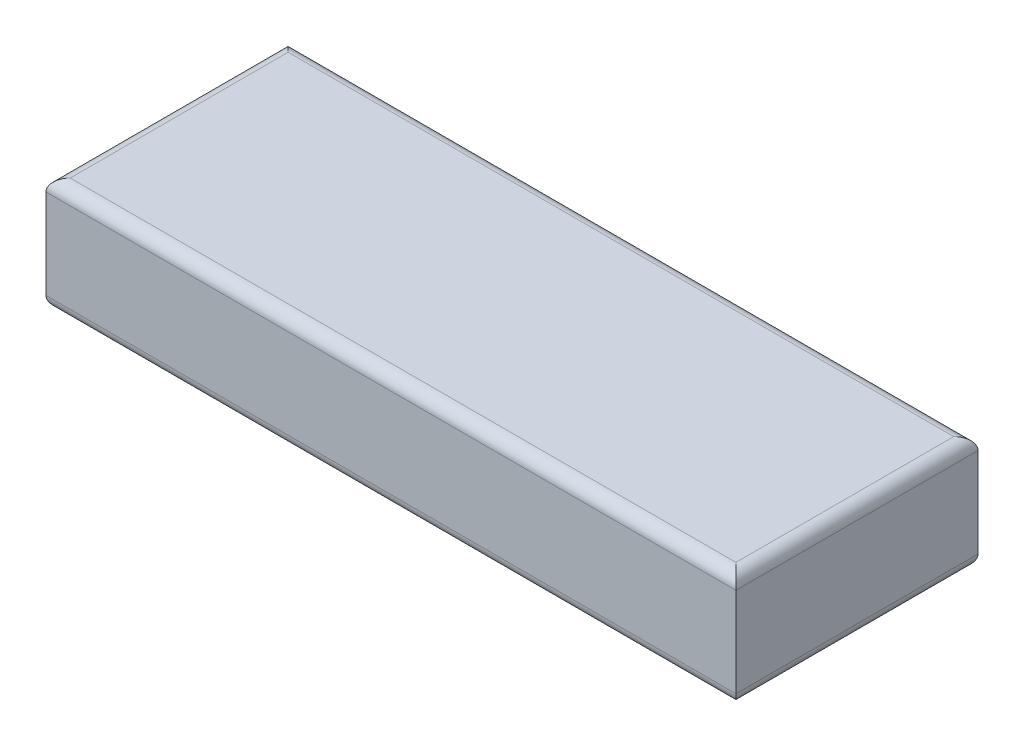
ISO-10303-21;
HEADER;
FILE_DESCRIPTION(('STEP AP214'),'2;1');
FILE_NAME('part.step','',(''),(''),'','','');
FILE_SCHEMA(('AUTOMOTIVE_DESIGN { 1 0 10303 214 1 1 1 1 }'));
ENDSEC;
DATA;
#1=APPLICATION_CONTEXT('core data for automotive mechanical design processes');
#2=APPLICATION_PROTOCOL_DEFINITION('international standard','automotive_design',2000,#1);
#3=PRODUCT_CONTEXT('',#1,'mechanical');
#4=PRODUCT('Part','Part','',(#3));
#5=PRODUCT_RELATED_PRODUCT_CATEGORY('part','',(#4));
#6=PRODUCT_DEFINITION_FORMATION('','',#4);
#7=PRODUCT_DEFINITION_CONTEXT('part definition',#1,'design');
#8=PRODUCT_DEFINITION('design','',#6,#7);
#9=PRODUCT_DEFINITION_SHAPE('','',#8);
#10=(LENGTH_UNIT() NAMED_UNIT(*) SI_UNIT(.MILLI.,.METRE.));
#11=(NAMED_UNIT(*) PLANE_ANGLE_UNIT() SI_UNIT($,.RADIAN.));
#12=(NAMED_UNIT(*) SI_UNIT($,.STERADIAN.) SOLID_ANGLE_UNIT());
#13=UNCERTAINTY_MEASURE_WITH_UNIT(LENGTH_MEASURE(1.E-05),#10,'distance_accuracy_value','');
#14=(GEOMETRIC_REPRESENTATION_CONTEXT(3) GLOBAL_UNCERTAINTY_ASSIGNED_CONTEXT((#13)) GLOBAL_UNIT_ASSIGNED_CONTEXT((#10,
#11,#12)) REPRESENTATION_CONTEXT('',''));
#15=CARTESIAN_POINT('',(0.,0.,0.));
#16=DIRECTION('',(0.,0.,1.));
#17=DIRECTION('',(1.,0.,0.));
#18=AXIS2_PLACEMENT_3D('',#15,#16,#17);
#19=CARTESIAN_POINT('',(14.478,4.77528789662104,-5.08));
#20=DIRECTION('',(-1.,0.,0.));
#21=DIRECTION('',(0.,0.,1.));
#22=AXIS2_PLACEMENT_3D('',#19,#20,#21);
#23=PLANE('',#22);
#24=DIRECTION('',(0.,-1.,0.));
#25=VECTOR('',#24,1.);
#26=CARTESIAN_POINT('',(14.478,4.77528789662104,-5.08));
#27=LINE('',#26,#25);
#28=CARTESIAN_POINT('',(14.478,4.26728789662104,-5.08));
#29=VERTEX_POINT('',#28);
#30=CARTESIAN_POINT('',(14.478,0.508000000000002,-5.08));
#31=VERTEX_POINT('',#30);
#32=EDGE_CURVE('E120',#29,#31,#27,.T.);
#33=ORIENTED_EDGE('',*,*,#32,.F.);
#34=DIRECTION('',(0.,0.,-1.));
#35=VECTOR('',#34,1.);
#36=CARTESIAN_POINT('',(14.478,4.26728789662104,5.08));
#37=LINE('',#36,#35);
#38=CARTESIAN_POINT('',(14.478,4.26728789662104,5.08));
#39=VERTEX_POINT('',#38);
#40=EDGE_CURVE('E144',#29,#39,#37,.F.);
#41=ORIENTED_EDGE('',*,*,#40,.T.);
#42=DIRECTION('',(0.,-1.,0.));
#43=VECTOR('',#42,1.);
#44=CARTESIAN_POINT('',(14.478,4.77528789662104,5.08));
#45=LINE('',#44,#43);
#46=CARTESIAN_POINT('',(14.478,0.508000000000002,5.08));
#47=VERTEX_POINT('',#46);
#48=EDGE_CURVE('E155',#39,#47,#45,.T.);
#49=ORIENTED_EDGE('',*,*,#48,.T.);
#50=DIRECTION('',(0.,0.,-1.));
#51=VECTOR('',#50,1.);
#52=CARTESIAN_POINT('',(14.478,0.508,-5.08));
#53=LINE('',#52,#51);
#54=EDGE_CURVE('E142',#47,#31,#53,.T.);
#55=ORIENTED_EDGE('',*,*,#54,.T.);
#56=EDGE_LOOP('',(#33,#41,#49,#55));
#57=FACE_BOUND('',#56,.T.);
#58=ADVANCED_FACE('F35',(#57),#23,.F.);
#59=CARTESIAN_POINT('',(-14.478,4.77528789662104,-5.08));
#60=DIRECTION('',(0.,0.,1.));
#61=DIRECTION('',(1.,0.,0.));
#62=AXIS2_PLACEMENT_3D('',#59,#60,#61);
#63=PLANE('',#62);
#64=DIRECTION('',(0.,-1.,0.));
#65=VECTOR('',#64,1.);
#66=CARTESIAN_POINT('',(-14.478,4.77528789662104,-5.08));
#67=LINE('',#66,#65);
#68=CARTESIAN_POINT('',(-14.478,4.26728789662104,-5.08));
#69=VERTEX_POINT('',#68);
#70=CARTESIAN_POINT('',(-14.478,0.508000000000002,-5.08));
#71=VERTEX_POINT('',#70);
#72=EDGE_CURVE('E322',#69,#71,#67,.T.);
#73=ORIENTED_EDGE('',*,*,#72,.F.);
#74=DIRECTION('',(-1.,0.,0.));
#75=VECTOR('',#74,1.);
#76=CARTESIAN_POINT('',(14.478,4.26728789662104,-5.08));
#77=LINE('',#76,#75);
#78=EDGE_CURVE('E140',#69,#29,#77,.F.);
#79=ORIENTED_EDGE('',*,*,#78,.T.);
#80=ORIENTED_EDGE('',*,*,#32,.T.);
#81=DIRECTION('',(-1.,0.,0.));
#82=VECTOR('',#81,1.);
#83=CARTESIAN_POINT('',(-14.478,0.508,-5.08));
#84=LINE('',#83,#82);
#85=EDGE_CURVE('E137',#31,#71,#84,.T.);
#86=ORIENTED_EDGE('',*,*,#85,.T.);
#87=EDGE_LOOP('',(#73,#79,#80,#86));
#88=FACE_BOUND('',#87,.T.);
#89=ADVANCED_FACE('F192',(#88),#63,.F.);
#90=CARTESIAN_POINT('',(-14.478,4.77528789662104,-5.08));
#91=DIRECTION('',(1.,0.,0.));
#92=DIRECTION('',(0.,0.,-1.));
#93=AXIS2_PLACEMENT_3D('',#90,#91,#92);
#94=PLANE('',#93);
#95=DIRECTION('',(0.,-1.,0.));
#96=VECTOR('',#95,1.);
#97=CARTESIAN_POINT('',(-14.478,4.77528789662104,5.08));
#98=LINE('',#97,#96);
#99=CARTESIAN_POINT('',(-14.478,4.26728789662104,5.08));
#100=VERTEX_POINT('',#99);
#101=CARTESIAN_POINT('',(-14.478,0.508000000000002,5.08));
#102=VERTEX_POINT('',#101);
#103=EDGE_CURVE('E318',#100,#102,#98,.T.);
#104=ORIENTED_EDGE('',*,*,#103,.F.);
#105=DIRECTION('',(0.,0.,1.));
#106=VECTOR('',#105,1.);
#107=CARTESIAN_POINT('',(-14.478,4.26728789662104,-5.08));
#108=LINE('',#107,#106);
#109=EDGE_CURVE('E135',#100,#69,#108,.F.);
#110=ORIENTED_EDGE('',*,*,#109,.T.);
#111=ORIENTED_EDGE('',*,*,#72,.T.);
#112=DIRECTION('',(0.,0.,1.));
#113=VECTOR('',#112,1.);
#114=CARTESIAN_POINT('',(-14.478,0.508,-5.08));
#115=LINE('',#114,#113);
#116=EDGE_CURVE('E133',#71,#102,#115,.T.);
#117=ORIENTED_EDGE('',*,*,#116,.T.);
#118=EDGE_LOOP('',(#104,#110,#111,#117));
#119=FACE_BOUND('',#118,.T.);
#120=ADVANCED_FACE('F198',(#119),#94,.F.);
#121=CARTESIAN_POINT('',(-14.478,4.77528789662104,5.08));
#122=DIRECTION('',(0.,0.,-1.));
#123=DIRECTION('',(-1.,0.,0.));
#124=AXIS2_PLACEMENT_3D('',#121,#122,#123);
#125=PLANE('',#124);
#126=ORIENTED_EDGE('',*,*,#48,.F.);
#127=DIRECTION('',(1.,0.,0.));
#128=VECTOR('',#127,1.);
#129=CARTESIAN_POINT('',(-14.478,4.26728789662104,5.08));
#130=LINE('',#129,#128);
#131=EDGE_CURVE('E107',#39,#100,#130,.F.);
#132=ORIENTED_EDGE('',*,*,#131,.T.);
#133=ORIENTED_EDGE('',*,*,#103,.T.);
#134=DIRECTION('',(1.,0.,0.));
#135=VECTOR('',#134,1.);
#136=CARTESIAN_POINT('',(-14.478,0.508,5.08));
#137=LINE('',#136,#135);
#138=EDGE_CURVE('E126',#102,#47,#137,.T.);
#139=ORIENTED_EDGE('',*,*,#138,.T.);
#140=EDGE_LOOP('',(#126,#132,#133,#139));
#141=FACE_BOUND('',#140,.T.);
#142=ADVANCED_FACE('F188',(#141),#125,.F.);
#143=CARTESIAN_POINT('',(0.,4.77528789662104,0.));
#144=DIRECTION('',(0.,1.,0.));
#145=DIRECTION('',(0.,0.,1.));
#146=AXIS2_PLACEMENT_3D('',#143,#144,#145);
#147=PLANE('',#146);
#148=DIRECTION('',(0.,0.,1.));
#149=VECTOR('',#148,1.);
#150=CARTESIAN_POINT('',(-13.97,4.77528789662104,5.08));
#151=LINE('',#150,#149);
#152=CARTESIAN_POINT('',(-13.97,4.77528789662104,-4.572));
#153=VERTEX_POINT('',#152);
#154=CARTESIAN_POINT('',(-13.97,4.77528789662104,4.572));
#155=VERTEX_POINT('',#154);
#156=EDGE_CURVE('E124',#153,#155,#151,.T.);
#157=ORIENTED_EDGE('',*,*,#156,.T.);
#158=DIRECTION('',(1.,0.,0.));
#159=VECTOR('',#158,1.);
#160=CARTESIAN_POINT('',(14.478,4.77528789662104,4.572));
#161=LINE('',#160,#159);
#162=CARTESIAN_POINT('',(13.97,4.77528789662104,4.572));
#163=VERTEX_POINT('',#162);
#164=EDGE_CURVE('E105',#155,#163,#161,.T.);
#165=ORIENTED_EDGE('',*,*,#164,.T.);
#166=DIRECTION('',(0.,0.,-1.));
#167=VECTOR('',#166,1.);
#168=CARTESIAN_POINT('',(13.97,4.77528789662104,-5.08));
#169=LINE('',#168,#167);
#170=CARTESIAN_POINT('',(13.97,4.77528789662104,-4.572));
#171=VERTEX_POINT('',#170);
#172=EDGE_CURVE('E113',#163,#171,#169,.T.);
#173=ORIENTED_EDGE('',*,*,#172,.T.);
#174=DIRECTION('',(-1.,0.,0.));
#175=VECTOR('',#174,1.);
#176=CARTESIAN_POINT('',(-14.478,4.77528789662104,-4.572));
#177=LINE('',#176,#175);
#178=EDGE_CURVE('E119',#171,#153,#177,.T.);
#179=ORIENTED_EDGE('',*,*,#178,.T.);
#180=EDGE_LOOP('',(#157,#165,#173,#179));
#181=FACE_BOUND('',#180,.T.);
#182=ADVANCED_FACE('F122',(#181),#147,.T.);
#183=CARTESIAN_POINT('',(0.,0.,0.));
#184=DIRECTION('',(0.,1.,0.));
#185=DIRECTION('',(0.,0.,1.));
#186=AXIS2_PLACEMENT_3D('',#183,#184,#185);
#187=PLANE('',#186);
#188=DIRECTION('',(0.,0.,1.));
#189=VECTOR('',#188,1.);
#190=CARTESIAN_POINT('',(-13.97,0.,0.));
#191=LINE('',#190,#189);
#192=CARTESIAN_POINT('',(-13.97,0.,4.572));
#193=VERTEX_POINT('',#192);
#194=CARTESIAN_POINT('',(-13.97,0.,-4.572));
#195=VERTEX_POINT('',#194);
#196=EDGE_CURVE('E44',#193,#195,#191,.F.);
#197=ORIENTED_EDGE('',*,*,#196,.T.);
#198=DIRECTION('',(-1.,0.,0.));
#199=VECTOR('',#198,1.);
#200=CARTESIAN_POINT('',(0.,0.,-4.572));
#201=LINE('',#200,#199);
#202=CARTESIAN_POINT('',(13.97,0.,-4.572));
#203=VERTEX_POINT('',#202);
#204=EDGE_CURVE('E11',#195,#203,#201,.F.);
#205=ORIENTED_EDGE('',*,*,#204,.T.);
#206=DIRECTION('',(0.,0.,-1.));
#207=VECTOR('',#206,1.);
#208=CARTESIAN_POINT('',(13.97,0.,0.));
#209=LINE('',#208,#207);
#210=CARTESIAN_POINT('',(13.97,0.,4.572));
#211=VERTEX_POINT('',#210);
#212=EDGE_CURVE('E146',#203,#211,#209,.F.);
#213=ORIENTED_EDGE('',*,*,#212,.T.);
#214=DIRECTION('',(1.,0.,0.));
#215=VECTOR('',#214,1.);
#216=CARTESIAN_POINT('',(0.,0.,4.572));
#217=LINE('',#216,#215);
#218=EDGE_CURVE('E55',#211,#193,#217,.F.);
#219=ORIENTED_EDGE('',*,*,#218,.T.);
#220=EDGE_LOOP('',(#197,#205,#213,#219));
#221=FACE_BOUND('',#220,.T.);
#222=ADVANCED_FACE('F177',(#221),#187,.F.);
#223=CARTESIAN_POINT('',(0.,4.26728789662104,-4.572));
#224=DIRECTION('',(1.,0.,0.));
#225=DIRECTION('',(0.,0.,-1.));
#226=AXIS2_PLACEMENT_3D('',#223,#224,#225);
#227=CYLINDRICAL_SURFACE('',#226,0.508);
#228=CARTESIAN_POINT('',(13.97,4.26728789662104,-4.572));
#229=DIRECTION('',(0.707106781186548,0.,0.707106781186547));
#230=DIRECTION('',(-0.707106781186547,0.,0.707106781186548));
#231=AXIS2_PLACEMENT_3D('',#228,#229,#230);
#232=ELLIPSE('',#231,0.718420489685532,0.508);
#233=EDGE_CURVE('E116',#29,#171,#232,.T.);
#234=ORIENTED_EDGE('',*,*,#233,.F.);
#235=ORIENTED_EDGE('',*,*,#78,.F.);
#236=CARTESIAN_POINT('',(-13.97,4.26728789662104,-4.572));
#237=DIRECTION('',(0.707106781186547,0.,-0.707106781186548));
#238=DIRECTION('',(0.707106781186548,0.,0.707106781186547));
#239=AXIS2_PLACEMENT_3D('',#236,#237,#238);
#240=ELLIPSE('',#239,0.718420489685532,0.508);
#241=EDGE_CURVE('E152',#153,#69,#240,.F.);
#242=ORIENTED_EDGE('',*,*,#241,.F.);
#243=ORIENTED_EDGE('',*,*,#178,.F.);
#244=EDGE_LOOP('',(#234,#235,#242,#243));
#245=FACE_BOUND('',#244,.T.);
#246=ADVANCED_FACE('F179',(#245),#227,.T.);
#247=CARTESIAN_POINT('',(-13.97,4.26728789662104,0.));
#248=DIRECTION('',(0.,0.,-1.));
#249=DIRECTION('',(-1.,0.,0.));
#250=AXIS2_PLACEMENT_3D('',#247,#248,#249);
#251=CYLINDRICAL_SURFACE('',#250,0.508);
#252=ORIENTED_EDGE('',*,*,#241,.T.);
#253=ORIENTED_EDGE('',*,*,#109,.F.);
#254=CARTESIAN_POINT('',(-13.97,4.26728789662104,4.572));
#255=DIRECTION('',(-0.707106781186548,0.,-0.707106781186547));
#256=DIRECTION('',(0.707106781186547,0.,-0.707106781186548));
#257=AXIS2_PLACEMENT_3D('',#254,#255,#256);
#258=ELLIPSE('',#257,0.718420489685532,0.508);
#259=EDGE_CURVE('E110',#155,#100,#258,.F.);
#260=ORIENTED_EDGE('',*,*,#259,.F.);
#261=ORIENTED_EDGE('',*,*,#156,.F.);
#262=EDGE_LOOP('',(#252,#253,#260,#261));
#263=FACE_BOUND('',#262,.T.);
#264=ADVANCED_FACE('F185',(#263),#251,.T.);
#265=CARTESIAN_POINT('',(13.97,4.26728789662104,0.));
#266=DIRECTION('',(0.,0.,1.));
#267=DIRECTION('',(1.,0.,0.));
#268=AXIS2_PLACEMENT_3D('',#265,#266,#267);
#269=CYLINDRICAL_SURFACE('',#268,0.508);
#270=ORIENTED_EDGE('',*,*,#233,.T.);
#271=ORIENTED_EDGE('',*,*,#172,.F.);
#272=CARTESIAN_POINT('',(13.97,4.26728789662104,4.572));
#273=DIRECTION('',(-0.707106781186547,0.,0.707106781186548));
#274=DIRECTION('',(0.707106781186548,0.,0.707106781186547));
#275=AXIS2_PLACEMENT_3D('',#272,#273,#274);
#276=ELLIPSE('',#275,0.718420489685532,0.508);
#277=EDGE_CURVE('E101',#39,#163,#276,.T.);
#278=ORIENTED_EDGE('',*,*,#277,.F.);
#279=ORIENTED_EDGE('',*,*,#40,.F.);
#280=EDGE_LOOP('',(#270,#271,#278,#279));
#281=FACE_BOUND('',#280,.T.);
#282=ADVANCED_FACE('F114',(#281),#269,.T.);
#283=CARTESIAN_POINT('',(0.,4.26728789662104,4.572));
#284=DIRECTION('',(-1.,0.,0.));
#285=DIRECTION('',(0.,0.,1.));
#286=AXIS2_PLACEMENT_3D('',#283,#284,#285);
#287=CYLINDRICAL_SURFACE('',#286,0.508);
#288=ORIENTED_EDGE('',*,*,#259,.T.);
#289=ORIENTED_EDGE('',*,*,#131,.F.);
#290=ORIENTED_EDGE('',*,*,#277,.T.);
#291=ORIENTED_EDGE('',*,*,#164,.F.);
#292=EDGE_LOOP('',(#288,#289,#290,#291));
#293=FACE_BOUND('',#292,.T.);
#294=ADVANCED_FACE('F103',(#293),#287,.T.);
#295=CARTESIAN_POINT('',(-14.478,0.508,4.572));
#296=DIRECTION('',(1.,0.,0.));
#297=DIRECTION('',(0.,0.,-1.));
#298=AXIS2_PLACEMENT_3D('',#295,#296,#297);
#299=CYLINDRICAL_SURFACE('',#298,0.508);
#300=CARTESIAN_POINT('',(-13.97,0.508,4.572));
#301=DIRECTION('',(0.707106781186548,0.,0.707106781186547));
#302=DIRECTION('',(0.707106781186547,0.,-0.707106781186548));
#303=AXIS2_PLACEMENT_3D('',#300,#301,#302);
#304=ELLIPSE('',#303,0.718420489685532,0.508);
#305=EDGE_CURVE('E159',#193,#102,#304,.F.);
#306=ORIENTED_EDGE('',*,*,#305,.F.);
#307=ORIENTED_EDGE('',*,*,#218,.F.);
#308=CARTESIAN_POINT('',(13.97,0.508,4.572));
#309=DIRECTION('',(0.707106781186547,0.,-0.707106781186548));
#310=DIRECTION('',(-0.707106781186548,0.,-0.707106781186547));
#311=AXIS2_PLACEMENT_3D('',#308,#309,#310);
#312=ELLIPSE('',#311,0.718420489685532,0.508);
#313=EDGE_CURVE('E39',#47,#211,#312,.T.);
#314=ORIENTED_EDGE('',*,*,#313,.F.);
#315=ORIENTED_EDGE('',*,*,#138,.F.);
#316=EDGE_LOOP('',(#306,#307,#314,#315));
#317=FACE_BOUND('',#316,.T.);
#318=ADVANCED_FACE('F37',(#317),#299,.T.);
#319=CARTESIAN_POINT('',(13.97,0.508,-5.08));
#320=DIRECTION('',(0.,0.,-1.));
#321=DIRECTION('',(-1.,0.,0.));
#322=AXIS2_PLACEMENT_3D('',#319,#320,#321);
#323=CYLINDRICAL_SURFACE('',#322,0.508);
#324=ORIENTED_EDGE('',*,*,#313,.T.);
#325=ORIENTED_EDGE('',*,*,#212,.F.);
#326=CARTESIAN_POINT('',(13.97,0.508,-4.572));
#327=DIRECTION('',(-0.707106781186548,0.,-0.707106781186547));
#328=DIRECTION('',(0.707106781186547,0.,-0.707106781186548));
#329=AXIS2_PLACEMENT_3D('',#326,#327,#328);
#330=ELLIPSE('',#329,0.718420489685532,0.508);
#331=EDGE_CURVE('E158',#31,#203,#330,.T.);
#332=ORIENTED_EDGE('',*,*,#331,.F.);
#333=ORIENTED_EDGE('',*,*,#54,.F.);
#334=EDGE_LOOP('',(#324,#325,#332,#333));
#335=FACE_BOUND('',#334,.T.);
#336=ADVANCED_FACE('F168',(#335),#323,.T.);
#337=CARTESIAN_POINT('',(-13.97,0.508,-5.08));
#338=DIRECTION('',(0.,0.,1.));
#339=DIRECTION('',(1.,0.,0.));
#340=AXIS2_PLACEMENT_3D('',#337,#338,#339);
#341=CYLINDRICAL_SURFACE('',#340,0.508);
#342=ORIENTED_EDGE('',*,*,#305,.T.);
#343=ORIENTED_EDGE('',*,*,#116,.F.);
#344=CARTESIAN_POINT('',(-13.97,0.508,-4.572));
#345=DIRECTION('',(-0.707106781186547,0.,0.707106781186548));
#346=DIRECTION('',(0.707106781186548,0.,0.707106781186547));
#347=AXIS2_PLACEMENT_3D('',#344,#345,#346);
#348=ELLIPSE('',#347,0.718420489685532,0.508);
#349=EDGE_CURVE('E156',#195,#71,#348,.F.);
#350=ORIENTED_EDGE('',*,*,#349,.F.);
#351=ORIENTED_EDGE('',*,*,#196,.F.);
#352=EDGE_LOOP('',(#342,#343,#350,#351));
#353=FACE_BOUND('',#352,.T.);
#354=ADVANCED_FACE('F173',(#353),#341,.T.);
#355=CARTESIAN_POINT('',(-14.478,0.508,-4.572));
#356=DIRECTION('',(-1.,0.,0.));
#357=DIRECTION('',(0.,0.,1.));
#358=AXIS2_PLACEMENT_3D('',#355,#356,#357);
#359=CYLINDRICAL_SURFACE('',#358,0.508);
#360=ORIENTED_EDGE('',*,*,#331,.T.);
#361=ORIENTED_EDGE('',*,*,#204,.F.);
#362=ORIENTED_EDGE('',*,*,#349,.T.);
#363=ORIENTED_EDGE('',*,*,#85,.F.);
#364=EDGE_LOOP('',(#360,#361,#362,#363));
#365=FACE_BOUND('',#364,.T.);
#366=ADVANCED_FACE('F176',(#365),#359,.T.);
#367=CLOSED_SHELL('',(#58,#89,#120,#142,#182,#222,#246,#264,#282,#294,#318,#336,#354,#366));
#368=MANIFOLD_SOLID_BREP('B2',#367);
#369=ADVANCED_BREP_SHAPE_REPRESENTATION('',(#18,#368),#14);
#370=SHAPE_DEFINITION_REPRESENTATION(#9,#369);
ENDSEC;
END-ISO-10303-21;
